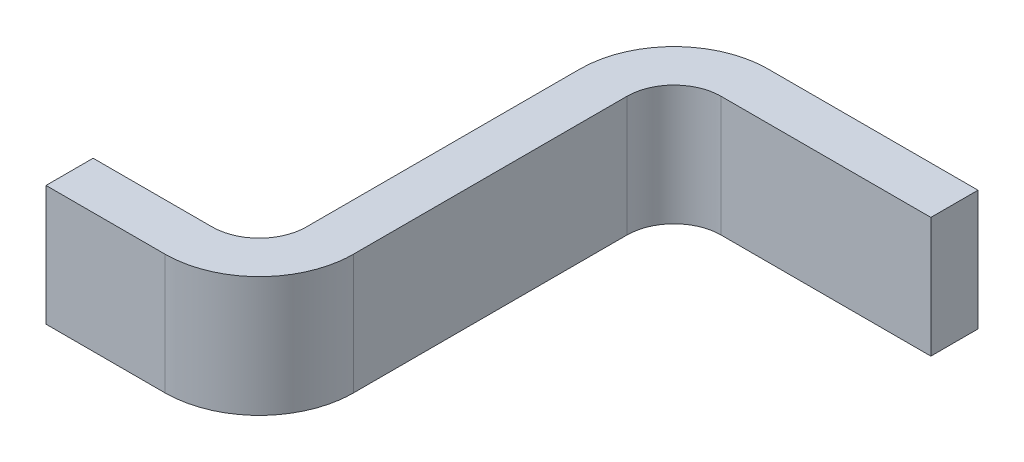
ISO-10303-21;
HEADER;
FILE_DESCRIPTION(('STEP AP214'),'2;1');
FILE_NAME('part.step','',(''),(''),'','','');
FILE_SCHEMA(('AUTOMOTIVE_DESIGN { 1 0 10303 214 1 1 1 1 }'));
ENDSEC;
DATA;
#1=APPLICATION_CONTEXT('core data for automotive mechanical design processes');
#2=APPLICATION_PROTOCOL_DEFINITION('international standard','automotive_design',2000,#1);
#3=PRODUCT_CONTEXT('',#1,'mechanical');
#4=PRODUCT('Part','Part','',(#3));
#5=PRODUCT_RELATED_PRODUCT_CATEGORY('part','',(#4));
#6=PRODUCT_DEFINITION_FORMATION('','',#4);
#7=PRODUCT_DEFINITION_CONTEXT('part definition',#1,'design');
#8=PRODUCT_DEFINITION('design','',#6,#7);
#9=PRODUCT_DEFINITION_SHAPE('','',#8);
#10=(LENGTH_UNIT() NAMED_UNIT(*) SI_UNIT(.MILLI.,.METRE.));
#11=(NAMED_UNIT(*) PLANE_ANGLE_UNIT() SI_UNIT($,.RADIAN.));
#12=(NAMED_UNIT(*) SI_UNIT($,.STERADIAN.) SOLID_ANGLE_UNIT());
#13=UNCERTAINTY_MEASURE_WITH_UNIT(LENGTH_MEASURE(1.E-05),#10,'distance_accuracy_value','');
#14=(GEOMETRIC_REPRESENTATION_CONTEXT(3) GLOBAL_UNCERTAINTY_ASSIGNED_CONTEXT((#13)) GLOBAL_UNIT_ASSIGNED_CONTEXT((#10,
#11,#12)) REPRESENTATION_CONTEXT('',''));
#15=CARTESIAN_POINT('',(0.,0.,0.));
#16=DIRECTION('',(0.,0.,1.));
#17=DIRECTION('',(1.,0.,0.));
#18=AXIS2_PLACEMENT_3D('',#15,#16,#17);
#19=CARTESIAN_POINT('',(5.59720518814807,7.03646464081757,3.04031594000001));
#20=CARTESIAN_POINT('',(5.59720518814807,6.73046464081757,3.04031594000001));
#21=CARTESIAN_POINT('',(5.59720518814807,7.03646464081757,2.92031594000001));
#22=CARTESIAN_POINT('',(5.59720518814807,6.73046464081757,2.92031594000001));
#23=(BOUNDED_SURFACE() B_SPLINE_SURFACE(1,1,((#19,#20),(#21,#22)),.UNSPECIFIED.,.F.,.F.,
.F.) B_SPLINE_SURFACE_WITH_KNOTS((2,2),(2,2),(-0.00011,1.E-05),(-0.0002805,2.55E-05),
.UNSPECIFIED.) GEOMETRIC_REPRESENTATION_ITEM() RATIONAL_B_SPLINE_SURFACE(((1.,1.),(1.,1.))) REPRESENTATION_ITEM('') SURFACE());
#24=CARTESIAN_POINT('',(5.59720518814807,6.75596464081757,2.93031594000001));
#25=CARTESIAN_POINT('',(5.59720518814807,6.75596464081757,3.03031594000001));
#26=(BOUNDED_CURVE() B_SPLINE_CURVE(1,(#24,#25),.UNSPECIFIED.,.F.,
.F.) B_SPLINE_CURVE_WITH_KNOTS((2,2),(-0.0001,0.),
.UNSPECIFIED.) CURVE() GEOMETRIC_REPRESENTATION_ITEM() RATIONAL_B_SPLINE_CURVE((1.,1.)) REPRESENTATION_ITEM(''));
#27=CARTESIAN_POINT('',(5.59720518814807,6.75596464081757,2.93031594000001));
#28=VERTEX_POINT('',#27);
#29=CARTESIAN_POINT('',(5.59720518814807,6.75596464081757,3.03031594000001));
#30=VERTEX_POINT('',#29);
#31=EDGE_CURVE('E371',#28,#30,#26,.T.);
#32=CARTESIAN_POINT('',(5.59720518814807,6.75596464081757,3.03031594000001));
#33=CARTESIAN_POINT('',(5.59720518814807,7.01096464081757,3.03031594000001));
#34=(BOUNDED_CURVE() B_SPLINE_CURVE(1,(#32,#33),.UNSPECIFIED.,.F.,
.F.) B_SPLINE_CURVE_WITH_KNOTS((2,2),(-0.000255,0.),
.UNSPECIFIED.) CURVE() GEOMETRIC_REPRESENTATION_ITEM() RATIONAL_B_SPLINE_CURVE((1.,1.)) REPRESENTATION_ITEM(''));
#35=CARTESIAN_POINT('',(5.59720518814807,7.01096464081757,3.03031594000001));
#36=VERTEX_POINT('',#35);
#37=EDGE_CURVE('E204',#30,#36,#34,.T.);
#38=CARTESIAN_POINT('',(5.59720518814807,7.01096464081757,3.03031594000001));
#39=CARTESIAN_POINT('',(5.59720518814807,7.01096464081757,2.93031594000001));
#40=(BOUNDED_CURVE() B_SPLINE_CURVE(1,(#38,#39),.UNSPECIFIED.,.F.,
.F.) B_SPLINE_CURVE_WITH_KNOTS((2,2),(-0.0001,0.),
.UNSPECIFIED.) CURVE() GEOMETRIC_REPRESENTATION_ITEM() RATIONAL_B_SPLINE_CURVE((1.,1.)) REPRESENTATION_ITEM(''));
#41=CARTESIAN_POINT('',(5.59720518814807,7.01096464081757,2.93031594000001));
#42=VERTEX_POINT('',#41);
#43=EDGE_CURVE('E167',#36,#42,#40,.T.);
#44=CARTESIAN_POINT('',(5.59720518814807,7.01096464081757,2.93031594000001));
#45=CARTESIAN_POINT('',(5.59720518814807,6.75596464081757,2.93031594000001));
#46=(BOUNDED_CURVE() B_SPLINE_CURVE(1,(#44,#45),.UNSPECIFIED.,.F.,
.F.) B_SPLINE_CURVE_WITH_KNOTS((2,2),(-0.000255,0.),
.UNSPECIFIED.) CURVE() GEOMETRIC_REPRESENTATION_ITEM() RATIONAL_B_SPLINE_CURVE((1.,1.)) REPRESENTATION_ITEM(''));
#47=EDGE_CURVE('E11',#42,#28,#46,.T.);
#48=ORIENTED_EDGE('',*,*,#31,.T.);
#49=ORIENTED_EDGE('',*,*,#37,.T.);
#50=ORIENTED_EDGE('',*,*,#43,.T.);
#51=ORIENTED_EDGE('',*,*,#47,.T.);
#52=EDGE_LOOP('',(#48,#49,#50,#51));
#53=FACE_BOUND('',#52,.T.);
#54=ADVANCED_FACE('F17',(#53),#23,.T.);
#55=CARTESIAN_POINT('',(5.57195518814807,6.73046464081757,2.93031594000001));
#56=CARTESIAN_POINT('',(5.87495518814806,6.73046464081757,2.93031594000001));
#57=CARTESIAN_POINT('',(5.57195518814807,7.03646464081757,2.93031594000001));
#58=CARTESIAN_POINT('',(5.87495518814806,7.03646464081757,2.93031594000001));
#59=(BOUNDED_SURFACE() B_SPLINE_SURFACE(1,1,((#55,#56),(#57,#58)),.UNSPECIFIED.,.F.,.F.,
.F.) B_SPLINE_SURFACE_WITH_KNOTS((2,2),(2,2),(-0.0002805,2.55E-05),(-2.5249999999999E-05,
0.000277749999999989),
.UNSPECIFIED.) GEOMETRIC_REPRESENTATION_ITEM() RATIONAL_B_SPLINE_SURFACE(((1.,1.),(1.,1.))) REPRESENTATION_ITEM('') SURFACE());
#60=CARTESIAN_POINT('',(5.84970518814806,7.01096464081757,2.93031594000001));
#61=CARTESIAN_POINT('',(5.84970518814806,6.75596464081757,2.93031594000001));
#62=(BOUNDED_CURVE() B_SPLINE_CURVE(1,(#60,#61),.UNSPECIFIED.,.F.,
.F.) B_SPLINE_CURVE_WITH_KNOTS((2,2),(-0.000255,0.),
.UNSPECIFIED.) CURVE() GEOMETRIC_REPRESENTATION_ITEM() RATIONAL_B_SPLINE_CURVE((1.,1.)) REPRESENTATION_ITEM(''));
#63=CARTESIAN_POINT('',(5.84970518814806,7.01096464081757,2.93031594000001));
#64=VERTEX_POINT('',#63);
#65=CARTESIAN_POINT('',(5.84970518814806,6.75596464081757,2.93031594000001));
#66=VERTEX_POINT('',#65);
#67=EDGE_CURVE('E32',#64,#66,#62,.T.);
#68=CARTESIAN_POINT('',(5.59720518814807,6.75596464081757,2.93031594000001));
#69=CARTESIAN_POINT('',(5.84970518814806,6.75596464081757,2.93031594000001));
#70=(BOUNDED_CURVE() B_SPLINE_CURVE(1,(#68,#69),.UNSPECIFIED.,.F.,
.F.) B_SPLINE_CURVE_WITH_KNOTS((2,2),(0.,0.00025249999999999),
.UNSPECIFIED.) CURVE() GEOMETRIC_REPRESENTATION_ITEM() RATIONAL_B_SPLINE_CURVE((1.,1.)) REPRESENTATION_ITEM(''));
#71=EDGE_CURVE('E203',#28,#66,#70,.T.);
#72=CARTESIAN_POINT('',(5.59720518814807,7.01096464081757,2.93031594000001));
#73=CARTESIAN_POINT('',(5.84970518814806,7.01096464081757,2.93031594000001));
#74=(BOUNDED_CURVE() B_SPLINE_CURVE(1,(#72,#73),.UNSPECIFIED.,.F.,
.F.) B_SPLINE_CURVE_WITH_KNOTS((2,2),(0.,0.00025249999999999),
.UNSPECIFIED.) CURVE() GEOMETRIC_REPRESENTATION_ITEM() RATIONAL_B_SPLINE_CURVE((1.,1.)) REPRESENTATION_ITEM(''));
#75=EDGE_CURVE('E158',#42,#64,#74,.T.);
#76=ORIENTED_EDGE('',*,*,#67,.T.);
#77=ORIENTED_EDGE('',*,*,#71,.F.);
#78=ORIENTED_EDGE('',*,*,#47,.F.);
#79=ORIENTED_EDGE('',*,*,#75,.T.);
#80=EDGE_LOOP('',(#76,#77,#78,#79));
#81=FACE_BOUND('',#80,.T.);
#82=ADVANCED_FACE('F714',(#81),#59,.T.);
#83=CARTESIAN_POINT('',(5.84970518814806,6.75596464081757,2.93031594000001));
#84=CARTESIAN_POINT('',(5.94970518814806,6.75596464081758,2.93031594000001));
#85=CARTESIAN_POINT('',(5.94970518814806,6.75596464081757,2.83031594000001));
#86=CARTESIAN_POINT('',(5.84970518814806,7.01096464081757,2.93031594000001));
#87=CARTESIAN_POINT('',(5.94970518814806,7.01096464081758,2.93031594000001));
#88=CARTESIAN_POINT('',(5.94970518814806,7.01096464081757,2.83031594000001));
#89=(BOUNDED_SURFACE() B_SPLINE_SURFACE(1,2,((#83,#84,#85),(#86,#87,#88)),.UNSPECIFIED.,.F.,.F.,
.F.) B_SPLINE_SURFACE_WITH_KNOTS((2,2),(3,3),(0.,2.55),(-3.14159265358979,-1.5707963267949),
.UNSPECIFIED.) GEOMETRIC_REPRESENTATION_ITEM() RATIONAL_B_SPLINE_SURFACE(((1.,0.707106781186548,
1.),(1.,0.707106781186548,1.))) REPRESENTATION_ITEM('') SURFACE());
#90=CARTESIAN_POINT('',(5.94970518814808,6.75596464081757,2.83031594000001));
#91=CARTESIAN_POINT('',(5.94970518814808,7.01096464081757,2.83031594000001));
#92=(BOUNDED_CURVE() B_SPLINE_CURVE(1,(#90,#91),.UNSPECIFIED.,.F.,
.F.) B_SPLINE_CURVE_WITH_KNOTS((2,2),(0.,0.000255),
.UNSPECIFIED.) CURVE() GEOMETRIC_REPRESENTATION_ITEM() RATIONAL_B_SPLINE_CURVE((1.,1.)) REPRESENTATION_ITEM(''));
#93=CARTESIAN_POINT('',(5.94970518814808,6.75596464081757,2.83031594000001));
#94=VERTEX_POINT('',#93);
#95=CARTESIAN_POINT('',(5.94970518814808,7.01096464081757,2.83031594000001));
#96=VERTEX_POINT('',#95);
#97=EDGE_CURVE('E232',#94,#96,#92,.T.);
#98=CARTESIAN_POINT('',(5.84970518814806,6.75596464081757,2.93031594000001));
#99=CARTESIAN_POINT('',(5.94970518814806,6.75596464081758,2.93031594000001));
#100=CARTESIAN_POINT('',(5.94970518814806,6.75596464081757,2.83031594000001));
#101=(BOUNDED_CURVE() B_SPLINE_CURVE(2,(#98,#99,#100),.UNSPECIFIED.,.F.,
.F.) B_SPLINE_CURVE_WITH_KNOTS((3,3),(0.,1.5707963267949),
.UNSPECIFIED.) CURVE() GEOMETRIC_REPRESENTATION_ITEM() RATIONAL_B_SPLINE_CURVE((1.,
0.707106781186545,1.)) REPRESENTATION_ITEM(''));
#102=EDGE_CURVE('E248',#66,#94,#101,.T.);
#103=CARTESIAN_POINT('',(5.84970518814806,7.01096464081757,2.93031594000001));
#104=CARTESIAN_POINT('',(5.94970518814806,7.01096464081757,2.93031594000001));
#105=CARTESIAN_POINT('',(5.94970518814806,7.01096464081757,2.83031594000001));
#106=(BOUNDED_CURVE() B_SPLINE_CURVE(2,(#103,#104,#105),.UNSPECIFIED.,.F.,
.F.) B_SPLINE_CURVE_WITH_KNOTS((3,3),(-3.14159265358979,-1.5707963267949),
.UNSPECIFIED.) CURVE() GEOMETRIC_REPRESENTATION_ITEM() RATIONAL_B_SPLINE_CURVE((1.,
0.707106781186545,1.)) REPRESENTATION_ITEM(''));
#107=EDGE_CURVE('E168',#64,#96,#106,.T.);
#108=ORIENTED_EDGE('',*,*,#97,.F.);
#109=ORIENTED_EDGE('',*,*,#102,.F.);
#110=ORIENTED_EDGE('',*,*,#67,.F.);
#111=ORIENTED_EDGE('',*,*,#107,.T.);
#112=EDGE_LOOP('',(#108,#109,#110,#111));
#113=FACE_BOUND('',#112,.T.);
#114=ADVANCED_FACE('F718',(#113),#89,.T.);
#115=CARTESIAN_POINT('',(5.94970518814808,6.73046464081757,2.88831594000001));
#116=CARTESIAN_POINT('',(5.94970518814808,6.73046464081757,2.19231594000001));
#117=CARTESIAN_POINT('',(5.94970518814808,7.03646464081757,2.88831594000001));
#118=CARTESIAN_POINT('',(5.94970518814808,7.03646464081757,2.19231594000001));
#119=(BOUNDED_SURFACE() B_SPLINE_SURFACE(1,1,((#115,#116),(#117,#118)),.UNSPECIFIED.,.F.,.F.,
.F.) B_SPLINE_SURFACE_WITH_KNOTS((2,2),(2,2),(-0.0002805,2.55E-05),(-5.8E-05,0.000638),
.UNSPECIFIED.) GEOMETRIC_REPRESENTATION_ITEM() RATIONAL_B_SPLINE_SURFACE(((1.,1.),(1.,1.))) REPRESENTATION_ITEM('') SURFACE());
#120=CARTESIAN_POINT('',(5.94970518814808,7.01096464081757,2.25031594000001));
#121=CARTESIAN_POINT('',(5.94970518814808,6.75596464081757,2.25031594000001));
#122=(BOUNDED_CURVE() B_SPLINE_CURVE(1,(#120,#121),.UNSPECIFIED.,.F.,
.F.) B_SPLINE_CURVE_WITH_KNOTS((2,2),(-0.000255,0.),
.UNSPECIFIED.) CURVE() GEOMETRIC_REPRESENTATION_ITEM() RATIONAL_B_SPLINE_CURVE((1.,1.)) REPRESENTATION_ITEM(''));
#123=CARTESIAN_POINT('',(5.94970518814808,7.01096464081757,2.25031594000001));
#124=VERTEX_POINT('',#123);
#125=CARTESIAN_POINT('',(5.94970518814808,6.75596464081757,2.25031594000001));
#126=VERTEX_POINT('',#125);
#127=EDGE_CURVE('E224',#124,#126,#122,.T.);
#128=CARTESIAN_POINT('',(5.94970518814808,6.75596464081757,2.83031594000001));
#129=CARTESIAN_POINT('',(5.94970518814808,6.75596464081757,2.25031594000001));
#130=(BOUNDED_CURVE() B_SPLINE_CURVE(1,(#128,#129),.UNSPECIFIED.,.F.,
.F.) B_SPLINE_CURVE_WITH_KNOTS((2,2),(0.0002,0.00078),
.UNSPECIFIED.) CURVE() GEOMETRIC_REPRESENTATION_ITEM() RATIONAL_B_SPLINE_CURVE((1.,1.)) REPRESENTATION_ITEM(''));
#131=EDGE_CURVE('E271',#94,#126,#130,.T.);
#132=CARTESIAN_POINT('',(5.94970518814808,7.01096464081757,2.83031594000001));
#133=CARTESIAN_POINT('',(5.94970518814808,7.01096464081757,2.25031594000001));
#134=(BOUNDED_CURVE() B_SPLINE_CURVE(1,(#132,#133),.UNSPECIFIED.,.F.,
.F.) B_SPLINE_CURVE_WITH_KNOTS((2,2),(0.,0.00058),
.UNSPECIFIED.) CURVE() GEOMETRIC_REPRESENTATION_ITEM() RATIONAL_B_SPLINE_CURVE((1.,1.)) REPRESENTATION_ITEM(''));
#135=EDGE_CURVE('E186',#96,#124,#134,.T.);
#136=ORIENTED_EDGE('',*,*,#127,.T.);
#137=ORIENTED_EDGE('',*,*,#131,.F.);
#138=ORIENTED_EDGE('',*,*,#97,.T.);
#139=ORIENTED_EDGE('',*,*,#135,.T.);
#140=EDGE_LOOP('',(#136,#137,#138,#139));
#141=FACE_BOUND('',#140,.T.);
#142=ADVANCED_FACE('F19',(#141),#119,.T.);
#143=CARTESIAN_POINT('',(5.94970518814809,6.75596464081757,2.25031594000001));
#144=CARTESIAN_POINT('',(5.94970518814809,6.75596464081758,2.05031594000001));
#145=CARTESIAN_POINT('',(6.14970518814809,6.75596464081757,2.05031594000001));
#146=CARTESIAN_POINT('',(5.94970518814809,7.01096464081757,2.25031594000001));
#147=CARTESIAN_POINT('',(5.94970518814809,7.01096464081758,2.05031594000001));
#148=CARTESIAN_POINT('',(6.14970518814809,7.01096464081757,2.05031594000001));
#149=(BOUNDED_SURFACE() B_SPLINE_SURFACE(1,2,((#143,#144,#145),(#146,#147,#148)),.UNSPECIFIED.,
.F.,.F.,.F.) B_SPLINE_SURFACE_WITH_KNOTS((2,2),(3,3),(-1.275,0.),(-1.5707963267949,0.),
.UNSPECIFIED.) GEOMETRIC_REPRESENTATION_ITEM() RATIONAL_B_SPLINE_SURFACE(((1.,0.707106781186548,
1.),(1.,0.707106781186548,1.))) REPRESENTATION_ITEM('') SURFACE());
#150=CARTESIAN_POINT('',(5.94970518814809,7.01096464081757,2.25031594000001));
#151=CARTESIAN_POINT('',(5.94970518814809,7.01096464081757,2.05031594000001));
#152=CARTESIAN_POINT('',(6.14970518814809,7.01096464081757,2.05031594000001));
#153=(BOUNDED_CURVE() B_SPLINE_CURVE(2,(#150,#151,#152),.UNSPECIFIED.,.F.,
.F.) B_SPLINE_CURVE_WITH_KNOTS((3,3),(-1.5707963267949,0.),
.UNSPECIFIED.) CURVE() GEOMETRIC_REPRESENTATION_ITEM() RATIONAL_B_SPLINE_CURVE((1.,
0.70710678118654,1.)) REPRESENTATION_ITEM(''));
#154=CARTESIAN_POINT('',(6.14970518814809,7.01096464081757,2.05031594000001));
#155=VERTEX_POINT('',#154);
#156=EDGE_CURVE('E195',#124,#155,#153,.T.);
#157=CARTESIAN_POINT('',(6.14970518814809,7.01096464081757,2.05031594000001));
#158=CARTESIAN_POINT('',(6.14970518814809,6.75596464081757,2.05031594000001));
#159=(BOUNDED_CURVE() B_SPLINE_CURVE(1,(#157,#158),.UNSPECIFIED.,.F.,
.F.) B_SPLINE_CURVE_WITH_KNOTS((2,2),(-0.000255,0.),
.UNSPECIFIED.) CURVE() GEOMETRIC_REPRESENTATION_ITEM() RATIONAL_B_SPLINE_CURVE((1.,1.)) REPRESENTATION_ITEM(''));
#160=CARTESIAN_POINT('',(6.14970518814809,6.75596464081757,2.05031594000001));
#161=VERTEX_POINT('',#160);
#162=EDGE_CURVE('E41',#155,#161,#159,.T.);
#163=CARTESIAN_POINT('',(5.94970518814809,6.75596464081757,2.25031594000001));
#164=CARTESIAN_POINT('',(5.94970518814809,6.75596464081757,2.05031594000001));
#165=CARTESIAN_POINT('',(6.14970518814809,6.75596464081757,2.05031594000001));
#166=(BOUNDED_CURVE() B_SPLINE_CURVE(2,(#163,#164,#165),.UNSPECIFIED.,.F.,
.F.) B_SPLINE_CURVE_WITH_KNOTS((3,3),(1.5707963267949,3.14159265358979),
.UNSPECIFIED.) CURVE() GEOMETRIC_REPRESENTATION_ITEM() RATIONAL_B_SPLINE_CURVE((1.,
0.70710678118654,1.)) REPRESENTATION_ITEM(''));
#167=EDGE_CURVE('E296',#126,#161,#166,.T.);
#168=ORIENTED_EDGE('',*,*,#156,.T.);
#169=ORIENTED_EDGE('',*,*,#162,.T.);
#170=ORIENTED_EDGE('',*,*,#167,.F.);
#171=ORIENTED_EDGE('',*,*,#127,.F.);
#172=EDGE_LOOP('',(#168,#169,#170,#171));
#173=FACE_BOUND('',#172,.T.);
#174=ADVANCED_FACE('F726',(#173),#149,.T.);
#175=CARTESIAN_POINT('',(6.10520518814809,6.73046464081757,2.05031594000001));
#176=CARTESIAN_POINT('',(6.63920518814809,6.73046464081757,2.05031594000001));
#177=CARTESIAN_POINT('',(6.10520518814809,7.03646464081757,2.05031594000001));
#178=CARTESIAN_POINT('',(6.63920518814809,7.03646464081757,2.05031594000001));
#179=(BOUNDED_SURFACE() B_SPLINE_SURFACE(1,1,((#175,#176),(#177,#178)),.UNSPECIFIED.,.F.,.F.,
.F.) B_SPLINE_SURFACE_WITH_KNOTS((2,2),(2,2),(-0.0002805,2.55E-05),(-4.45E-05,0.0004895),
.UNSPECIFIED.) GEOMETRIC_REPRESENTATION_ITEM() RATIONAL_B_SPLINE_SURFACE(((1.,1.),(1.,1.))) REPRESENTATION_ITEM('') SURFACE());
#180=CARTESIAN_POINT('',(6.59470518814809,7.01096464081757,2.05031594000001));
#181=CARTESIAN_POINT('',(6.59470518814809,6.75596464081757,2.05031594000001));
#182=(BOUNDED_CURVE() B_SPLINE_CURVE(1,(#180,#181),.UNSPECIFIED.,.F.,
.F.) B_SPLINE_CURVE_WITH_KNOTS((2,2),(-0.000255,0.),
.UNSPECIFIED.) CURVE() GEOMETRIC_REPRESENTATION_ITEM() RATIONAL_B_SPLINE_CURVE((1.,1.)) REPRESENTATION_ITEM(''));
#183=CARTESIAN_POINT('',(6.59470518814809,7.01096464081757,2.05031594000001));
#184=VERTEX_POINT('',#183);
#185=CARTESIAN_POINT('',(6.59470518814809,6.75596464081757,2.05031594000001));
#186=VERTEX_POINT('',#185);
#187=EDGE_CURVE('E305',#184,#186,#182,.T.);
#188=CARTESIAN_POINT('',(6.14970518814809,6.75596464081757,2.05031594000001));
#189=CARTESIAN_POINT('',(6.59470518814809,6.75596464081757,2.05031594000001));
#190=(BOUNDED_CURVE() B_SPLINE_CURVE(1,(#188,#189),.UNSPECIFIED.,.F.,
.F.) B_SPLINE_CURVE_WITH_KNOTS((2,2),(0.00055250000000002,0.00099750000000002),
.UNSPECIFIED.) CURVE() GEOMETRIC_REPRESENTATION_ITEM() RATIONAL_B_SPLINE_CURVE((1.,1.)) REPRESENTATION_ITEM(''));
#191=EDGE_CURVE('E23',#161,#186,#190,.T.);
#192=CARTESIAN_POINT('',(6.14970518814809,7.01096464081757,2.05031594000001));
#193=CARTESIAN_POINT('',(6.59470518814809,7.01096464081757,2.05031594000001));
#194=(BOUNDED_CURVE() B_SPLINE_CURVE(1,(#192,#193),.UNSPECIFIED.,.F.,
.F.) B_SPLINE_CURVE_WITH_KNOTS((2,2),(0.,0.000445),
.UNSPECIFIED.) CURVE() GEOMETRIC_REPRESENTATION_ITEM() RATIONAL_B_SPLINE_CURVE((1.,1.)) REPRESENTATION_ITEM(''));
#195=EDGE_CURVE('E240',#155,#184,#194,.T.);
#196=ORIENTED_EDGE('',*,*,#187,.T.);
#197=ORIENTED_EDGE('',*,*,#191,.F.);
#198=ORIENTED_EDGE('',*,*,#162,.F.);
#199=ORIENTED_EDGE('',*,*,#195,.T.);
#200=EDGE_LOOP('',(#196,#197,#198,#199));
#201=FACE_BOUND('',#200,.T.);
#202=ADVANCED_FACE('F413',(#201),#179,.T.);
#203=CARTESIAN_POINT('',(5.49745518814807,6.75596464081757,3.12831594000001));
#204=CARTESIAN_POINT('',(6.69445518814809,6.75596464081757,3.12831594000001));
#205=CARTESIAN_POINT('',(5.49745518814807,6.75596464081757,1.95231594000001));
#206=CARTESIAN_POINT('',(6.69445518814809,6.75596464081757,1.95231594000001));
#207=(BOUNDED_SURFACE() B_SPLINE_SURFACE(1,1,((#203,#204),(#205,#206)),.UNSPECIFIED.,.F.,.F.,
.F.) B_SPLINE_SURFACE_WITH_KNOTS((2,2),(2,2),(-0.001078,9.8E-05),(-9.9750000000002E-05,
0.00109725000000002),
.UNSPECIFIED.) GEOMETRIC_REPRESENTATION_ITEM() RATIONAL_B_SPLINE_SURFACE(((1.,1.),(1.,1.))) REPRESENTATION_ITEM('') SURFACE());
#208=CARTESIAN_POINT('',(6.59470518814809,6.75596464081757,2.05031594000001));
#209=CARTESIAN_POINT('',(6.59470518814809,6.75596464081757,2.15031594000001));
#210=(BOUNDED_CURVE() B_SPLINE_CURVE(1,(#208,#209),.UNSPECIFIED.,.F.,
.F.) B_SPLINE_CURVE_WITH_KNOTS((2,2),(-0.00098,-0.00088),
.UNSPECIFIED.) CURVE() GEOMETRIC_REPRESENTATION_ITEM() RATIONAL_B_SPLINE_CURVE((1.,1.)) REPRESENTATION_ITEM(''));
#211=CARTESIAN_POINT('',(6.59470518814809,6.75596464081757,2.15031594000001));
#212=VERTEX_POINT('',#211);
#213=EDGE_CURVE('E363',#186,#212,#210,.T.);
#214=CARTESIAN_POINT('',(6.14970518814809,6.75596464081757,2.15031594000001));
#215=CARTESIAN_POINT('',(6.59470518814809,6.75596464081757,2.15031594000001));
#216=(BOUNDED_CURVE() B_SPLINE_CURVE(1,(#214,#215),.UNSPECIFIED.,.F.,
.F.) B_SPLINE_CURVE_WITH_KNOTS((2,2),(0.,0.000445),
.UNSPECIFIED.) CURVE() GEOMETRIC_REPRESENTATION_ITEM() RATIONAL_B_SPLINE_CURVE((1.,1.)) REPRESENTATION_ITEM(''));
#217=CARTESIAN_POINT('',(6.14970518814809,6.75596464081757,2.15031594000001));
#218=VERTEX_POINT('',#217);
#219=EDGE_CURVE('E169',#218,#212,#216,.T.);
#220=CARTESIAN_POINT('',(6.04970518814809,6.75596464081757,2.25031594000001));
#221=CARTESIAN_POINT('',(6.04970518814809,6.75596464081757,2.15031594000001));
#222=CARTESIAN_POINT('',(6.14970518814809,6.75596464081757,2.15031594000001));
#223=(BOUNDED_CURVE() B_SPLINE_CURVE(2,(#220,#221,#222),.UNSPECIFIED.,.F.,
.F.) B_SPLINE_CURVE_WITH_KNOTS((3,3),(1.5707963267949,3.14159265358979),
.UNSPECIFIED.) CURVE() GEOMETRIC_REPRESENTATION_ITEM() RATIONAL_B_SPLINE_CURVE((1.,
0.707106781186553,1.)) REPRESENTATION_ITEM(''));
#224=CARTESIAN_POINT('',(6.04970518814807,6.75596464081757,2.25031594000001));
#225=VERTEX_POINT('',#224);
#226=EDGE_CURVE('E123',#225,#218,#223,.T.);
#227=CARTESIAN_POINT('',(6.04970518814807,6.75596464081757,2.83031594000001));
#228=CARTESIAN_POINT('',(6.04970518814807,6.75596464081757,2.25031594000001));
#229=(BOUNDED_CURVE() B_SPLINE_CURVE(1,(#227,#228),.UNSPECIFIED.,.F.,
.F.) B_SPLINE_CURVE_WITH_KNOTS((2,2),(0.,0.00058),
.UNSPECIFIED.) CURVE() GEOMETRIC_REPRESENTATION_ITEM() RATIONAL_B_SPLINE_CURVE((1.,1.)) REPRESENTATION_ITEM(''));
#230=CARTESIAN_POINT('',(6.04970518814807,6.75596464081757,2.83031594000001));
#231=VERTEX_POINT('',#230);
#232=EDGE_CURVE('E116',#231,#225,#229,.T.);
#233=CARTESIAN_POINT('',(5.84970518814806,6.75596464081757,3.03031594000001));
#234=CARTESIAN_POINT('',(6.04970518814806,6.75596464081757,3.03031594000001));
#235=CARTESIAN_POINT('',(6.04970518814806,6.75596464081757,2.83031594000001));
#236=(BOUNDED_CURVE() B_SPLINE_CURVE(2,(#233,#234,#235),.UNSPECIFIED.,.F.,
.F.) B_SPLINE_CURVE_WITH_KNOTS((3,3),(0.,1.5707963267949),
.UNSPECIFIED.) CURVE() GEOMETRIC_REPRESENTATION_ITEM() RATIONAL_B_SPLINE_CURVE((1.,
0.707106781186537,1.)) REPRESENTATION_ITEM(''));
#237=CARTESIAN_POINT('',(5.84970518814806,6.75596464081757,3.03031594000001));
#238=VERTEX_POINT('',#237);
#239=EDGE_CURVE('E105',#238,#231,#236,.T.);
#240=CARTESIAN_POINT('',(5.59720518814807,6.75596464081757,3.03031594000001));
#241=CARTESIAN_POINT('',(5.84970518814806,6.75596464081757,3.03031594000001));
#242=(BOUNDED_CURVE() B_SPLINE_CURVE(1,(#240,#241),.UNSPECIFIED.,.F.,
.F.) B_SPLINE_CURVE_WITH_KNOTS((2,2),(0.,0.00025249999999999),
.UNSPECIFIED.) CURVE() GEOMETRIC_REPRESENTATION_ITEM() RATIONAL_B_SPLINE_CURVE((1.,1.)) REPRESENTATION_ITEM(''));
#243=EDGE_CURVE('E196',#30,#238,#242,.T.);
#244=ORIENTED_EDGE('',*,*,#71,.T.);
#245=ORIENTED_EDGE('',*,*,#102,.T.);
#246=ORIENTED_EDGE('',*,*,#131,.T.);
#247=ORIENTED_EDGE('',*,*,#167,.T.);
#248=ORIENTED_EDGE('',*,*,#191,.T.);
#249=ORIENTED_EDGE('',*,*,#213,.T.);
#250=ORIENTED_EDGE('',*,*,#219,.F.);
#251=ORIENTED_EDGE('',*,*,#226,.F.);
#252=ORIENTED_EDGE('',*,*,#232,.F.);
#253=ORIENTED_EDGE('',*,*,#239,.F.);
#254=ORIENTED_EDGE('',*,*,#243,.F.);
#255=ORIENTED_EDGE('',*,*,#31,.F.);
#256=EDGE_LOOP('',(#244,#245,#246,#247,#248,#249,#250,#251,#252,#253,#254,#255));
#257=FACE_BOUND('',#256,.T.);
#258=ADVANCED_FACE('F120',(#257),#207,.T.);
#259=CARTESIAN_POINT('',(5.57195518814807,7.03646464081757,3.03031594000001));
#260=CARTESIAN_POINT('',(5.87495518814806,7.03646464081757,3.03031594000001));
#261=CARTESIAN_POINT('',(5.57195518814807,6.73046464081757,3.03031594000001));
#262=CARTESIAN_POINT('',(5.87495518814806,6.73046464081757,3.03031594000001));
#263=(BOUNDED_SURFACE() B_SPLINE_SURFACE(1,1,((#259,#260),(#261,#262)),.UNSPECIFIED.,.F.,.F.,
.F.) B_SPLINE_SURFACE_WITH_KNOTS((2,2),(2,2),(-0.0002805,2.55E-05),(-2.5249999999999E-05,
0.000277749999999989),
.UNSPECIFIED.) GEOMETRIC_REPRESENTATION_ITEM() RATIONAL_B_SPLINE_SURFACE(((1.,1.),(1.,1.))) REPRESENTATION_ITEM('') SURFACE());
#264=CARTESIAN_POINT('',(5.84970518814806,6.75596464081757,3.03031594000001));
#265=CARTESIAN_POINT('',(5.84970518814806,7.01096464081757,3.03031594000001));
#266=(BOUNDED_CURVE() B_SPLINE_CURVE(1,(#264,#265),.UNSPECIFIED.,.F.,
.F.) B_SPLINE_CURVE_WITH_KNOTS((2,2),(-0.000255,0.),
.UNSPECIFIED.) CURVE() GEOMETRIC_REPRESENTATION_ITEM() RATIONAL_B_SPLINE_CURVE((1.,1.)) REPRESENTATION_ITEM(''));
#267=CARTESIAN_POINT('',(5.84970518814806,7.01096464081757,3.03031594000001));
#268=VERTEX_POINT('',#267);
#269=EDGE_CURVE('E112',#238,#268,#266,.T.);
#270=CARTESIAN_POINT('',(5.59720518814807,7.01096464081757,3.03031594000001));
#271=CARTESIAN_POINT('',(5.84970518814806,7.01096464081757,3.03031594000001));
#272=(BOUNDED_CURVE() B_SPLINE_CURVE(1,(#270,#271),.UNSPECIFIED.,.F.,
.F.) B_SPLINE_CURVE_WITH_KNOTS((2,2),(0.,0.00025249999999999),
.UNSPECIFIED.) CURVE() GEOMETRIC_REPRESENTATION_ITEM() RATIONAL_B_SPLINE_CURVE((1.,1.)) REPRESENTATION_ITEM(''));
#273=EDGE_CURVE('E379',#36,#268,#272,.T.);
#274=ORIENTED_EDGE('',*,*,#269,.T.);
#275=ORIENTED_EDGE('',*,*,#273,.F.);
#276=ORIENTED_EDGE('',*,*,#37,.F.);
#277=ORIENTED_EDGE('',*,*,#243,.T.);
#278=EDGE_LOOP('',(#274,#275,#276,#277));
#279=FACE_BOUND('',#278,.T.);
#280=ADVANCED_FACE('F689',(#279),#263,.T.);
#281=CARTESIAN_POINT('',(5.84970518814806,7.01096464081757,3.03031594000001));
#282=CARTESIAN_POINT('',(6.04970518814806,7.01096464081758,3.03031594000001));
#283=CARTESIAN_POINT('',(6.04970518814806,7.01096464081757,2.83031594000001));
#284=CARTESIAN_POINT('',(5.84970518814806,6.75596464081757,3.03031594000001));
#285=CARTESIAN_POINT('',(6.04970518814806,6.75596464081758,3.03031594000001));
#286=CARTESIAN_POINT('',(6.04970518814806,6.75596464081757,2.83031594000001));
#287=(BOUNDED_SURFACE() B_SPLINE_SURFACE(1,2,((#281,#282,#283),(#284,#285,#286)),.UNSPECIFIED.,
.F.,.F.,.F.) B_SPLINE_SURFACE_WITH_KNOTS((2,2),(3,3),(-1.275,0.),(-3.14159265358979,
-1.5707963267949),.UNSPECIFIED.) GEOMETRIC_REPRESENTATION_ITEM() RATIONAL_B_SPLINE_SURFACE(((1.,
0.707106781186548,1.),(1.,0.707106781186548,1.))) REPRESENTATION_ITEM('') SURFACE());
#288=CARTESIAN_POINT('',(6.04970518814807,6.75596464081757,2.83031594000001));
#289=CARTESIAN_POINT('',(6.04970518814807,7.01096464081757,2.83031594000001));
#290=(BOUNDED_CURVE() B_SPLINE_CURVE(1,(#288,#289),.UNSPECIFIED.,.F.,
.F.) B_SPLINE_CURVE_WITH_KNOTS((2,2),(-0.000255,0.),
.UNSPECIFIED.) CURVE() GEOMETRIC_REPRESENTATION_ITEM() RATIONAL_B_SPLINE_CURVE((1.,1.)) REPRESENTATION_ITEM(''));
#291=CARTESIAN_POINT('',(6.04970518814807,7.01096464081757,2.83031594000001));
#292=VERTEX_POINT('',#291);
#293=EDGE_CURVE('E110',#231,#292,#290,.T.);
#294=CARTESIAN_POINT('',(5.84970518814806,7.01096464081757,3.03031594000001));
#295=CARTESIAN_POINT('',(6.04970518814806,7.01096464081757,3.03031594000001));
#296=CARTESIAN_POINT('',(6.04970518814806,7.01096464081757,2.83031594000001));
#297=(BOUNDED_CURVE() B_SPLINE_CURVE(2,(#294,#295,#296),.UNSPECIFIED.,.F.,
.F.) B_SPLINE_CURVE_WITH_KNOTS((3,3),(-3.14159265358979,-1.5707963267949),
.UNSPECIFIED.) CURVE() GEOMETRIC_REPRESENTATION_ITEM() RATIONAL_B_SPLINE_CURVE((1.,
0.707106781186537,1.)) REPRESENTATION_ITEM(''));
#298=EDGE_CURVE('E144',#268,#292,#297,.T.);
#299=ORIENTED_EDGE('',*,*,#239,.T.);
#300=ORIENTED_EDGE('',*,*,#293,.T.);
#301=ORIENTED_EDGE('',*,*,#298,.F.);
#302=ORIENTED_EDGE('',*,*,#269,.F.);
#303=EDGE_LOOP('',(#299,#300,#301,#302));
#304=FACE_BOUND('',#303,.T.);
#305=ADVANCED_FACE('F107',(#304),#287,.T.);
#306=CARTESIAN_POINT('',(6.04970518814807,7.03646464081757,2.88831594000001));
#307=CARTESIAN_POINT('',(6.04970518814807,7.03646464081757,2.19231594000001));
#308=CARTESIAN_POINT('',(6.04970518814807,6.73046464081757,2.88831594000001));
#309=CARTESIAN_POINT('',(6.04970518814807,6.73046464081757,2.19231594000001));
#310=(BOUNDED_SURFACE() B_SPLINE_SURFACE(1,1,((#306,#307),(#308,#309)),.UNSPECIFIED.,.F.,.F.,
.F.) B_SPLINE_SURFACE_WITH_KNOTS((2,2),(2,2),(-0.0002805,2.55E-05),(-5.8E-05,0.000638),
.UNSPECIFIED.) GEOMETRIC_REPRESENTATION_ITEM() RATIONAL_B_SPLINE_SURFACE(((1.,1.),(1.,1.))) REPRESENTATION_ITEM('') SURFACE());
#311=CARTESIAN_POINT('',(6.04970518814807,6.75596464081757,2.25031594000001));
#312=CARTESIAN_POINT('',(6.04970518814807,7.01096464081757,2.25031594000001));
#313=(BOUNDED_CURVE() B_SPLINE_CURVE(1,(#311,#312),.UNSPECIFIED.,.F.,
.F.) B_SPLINE_CURVE_WITH_KNOTS((2,2),(-0.000255,0.),
.UNSPECIFIED.) CURVE() GEOMETRIC_REPRESENTATION_ITEM() RATIONAL_B_SPLINE_CURVE((1.,1.)) REPRESENTATION_ITEM(''));
#314=CARTESIAN_POINT('',(6.04970518814807,7.01096464081757,2.25031594000001));
#315=VERTEX_POINT('',#314);
#316=EDGE_CURVE('E138',#225,#315,#313,.T.);
#317=CARTESIAN_POINT('',(6.04970518814807,7.01096464081757,2.83031594000001));
#318=CARTESIAN_POINT('',(6.04970518814807,7.01096464081757,2.25031594000001));
#319=(BOUNDED_CURVE() B_SPLINE_CURVE(1,(#317,#318),.UNSPECIFIED.,.F.,
.F.) B_SPLINE_CURVE_WITH_KNOTS((2,2),(0.0001,0.00068),
.UNSPECIFIED.) CURVE() GEOMETRIC_REPRESENTATION_ITEM() RATIONAL_B_SPLINE_CURVE((1.,1.)) REPRESENTATION_ITEM(''));
#320=EDGE_CURVE('E130',#292,#315,#319,.T.);
#321=ORIENTED_EDGE('',*,*,#316,.T.);
#322=ORIENTED_EDGE('',*,*,#320,.F.);
#323=ORIENTED_EDGE('',*,*,#293,.F.);
#324=ORIENTED_EDGE('',*,*,#232,.T.);
#325=EDGE_LOOP('',(#321,#322,#323,#324));
#326=FACE_BOUND('',#325,.T.);
#327=ADVANCED_FACE('F128',(#326),#310,.T.);
#328=CARTESIAN_POINT('',(6.04970518814809,7.01096464081757,2.25031594000001));
#329=CARTESIAN_POINT('',(6.04970518814809,7.01096464081758,2.15031594000001));
#330=CARTESIAN_POINT('',(6.14970518814809,7.01096464081757,2.15031594000001));
#331=CARTESIAN_POINT('',(6.04970518814809,6.75596464081757,2.25031594000001));
#332=CARTESIAN_POINT('',(6.04970518814809,6.75596464081758,2.15031594000001));
#333=CARTESIAN_POINT('',(6.14970518814809,6.75596464081757,2.15031594000001));
#334=(BOUNDED_SURFACE() B_SPLINE_SURFACE(1,2,((#328,#329,#330),(#331,#332,#333)),.UNSPECIFIED.,
.F.,.F.,.F.) B_SPLINE_SURFACE_WITH_KNOTS((2,2),(3,3),(0.,2.55),(-1.5707963267949,0.),
.UNSPECIFIED.) GEOMETRIC_REPRESENTATION_ITEM() RATIONAL_B_SPLINE_SURFACE(((1.,0.707106781186548,
1.),(1.,0.707106781186548,1.))) REPRESENTATION_ITEM('') SURFACE());
#335=CARTESIAN_POINT('',(6.14970518814809,7.01096464081757,2.15031594000001));
#336=CARTESIAN_POINT('',(6.14970518814809,6.75596464081757,2.15031594000001));
#337=(BOUNDED_CURVE() B_SPLINE_CURVE(1,(#335,#336),.UNSPECIFIED.,.F.,
.F.) B_SPLINE_CURVE_WITH_KNOTS((2,2),(0.,0.000255),
.UNSPECIFIED.) CURVE() GEOMETRIC_REPRESENTATION_ITEM() RATIONAL_B_SPLINE_CURVE((1.,1.)) REPRESENTATION_ITEM(''));
#338=CARTESIAN_POINT('',(6.14970518814809,7.01096464081757,2.15031594000001));
#339=VERTEX_POINT('',#338);
#340=EDGE_CURVE('E177',#339,#218,#337,.T.);
#341=CARTESIAN_POINT('',(6.04970518814809,7.01096464081757,2.25031594000001));
#342=CARTESIAN_POINT('',(6.04970518814809,7.01096464081757,2.15031594000001));
#343=CARTESIAN_POINT('',(6.14970518814809,7.01096464081757,2.15031594000001));
#344=(BOUNDED_CURVE() B_SPLINE_CURVE(2,(#341,#342,#343),.UNSPECIFIED.,.F.,
.F.) B_SPLINE_CURVE_WITH_KNOTS((3,3),(-1.5707963267949,0.),
.UNSPECIFIED.) CURVE() GEOMETRIC_REPRESENTATION_ITEM() RATIONAL_B_SPLINE_CURVE((1.,
0.707106781186553,1.)) REPRESENTATION_ITEM(''));
#345=EDGE_CURVE('E148',#315,#339,#344,.T.);
#346=ORIENTED_EDGE('',*,*,#340,.F.);
#347=ORIENTED_EDGE('',*,*,#345,.F.);
#348=ORIENTED_EDGE('',*,*,#316,.F.);
#349=ORIENTED_EDGE('',*,*,#226,.T.);
#350=EDGE_LOOP('',(#346,#347,#348,#349));
#351=FACE_BOUND('',#350,.T.);
#352=ADVANCED_FACE('F424',(#351),#334,.T.);
#353=CARTESIAN_POINT('',(6.10520518814809,7.03646464081757,2.15031594000001));
#354=CARTESIAN_POINT('',(6.63920518814809,7.03646464081757,2.15031594000001));
#355=CARTESIAN_POINT('',(6.10520518814809,6.73046464081757,2.15031594000001));
#356=CARTESIAN_POINT('',(6.63920518814809,6.73046464081757,2.15031594000001));
#357=(BOUNDED_SURFACE() B_SPLINE_SURFACE(1,1,((#353,#354),(#355,#356)),.UNSPECIFIED.,.F.,.F.,
.F.) B_SPLINE_SURFACE_WITH_KNOTS((2,2),(2,2),(-0.0002805,2.55E-05),(-4.45E-05,0.0004895),
.UNSPECIFIED.) GEOMETRIC_REPRESENTATION_ITEM() RATIONAL_B_SPLINE_SURFACE(((1.,1.),(1.,1.))) REPRESENTATION_ITEM('') SURFACE());
#358=CARTESIAN_POINT('',(6.59470518814809,6.75596464081757,2.15031594000001));
#359=CARTESIAN_POINT('',(6.59470518814809,7.01096464081757,2.15031594000001));
#360=(BOUNDED_CURVE() B_SPLINE_CURVE(1,(#358,#359),.UNSPECIFIED.,.F.,
.F.) B_SPLINE_CURVE_WITH_KNOTS((2,2),(-0.000255,0.),
.UNSPECIFIED.) CURVE() GEOMETRIC_REPRESENTATION_ITEM() RATIONAL_B_SPLINE_CURVE((1.,1.)) REPRESENTATION_ITEM(''));
#361=CARTESIAN_POINT('',(6.59470518814809,7.01096464081757,2.15031594000001));
#362=VERTEX_POINT('',#361);
#363=EDGE_CURVE('E347',#212,#362,#360,.T.);
#364=CARTESIAN_POINT('',(6.14970518814809,7.01096464081757,2.15031594000001));
#365=CARTESIAN_POINT('',(6.59470518814809,7.01096464081757,2.15031594000001));
#366=(BOUNDED_CURVE() B_SPLINE_CURVE(1,(#364,#365),.UNSPECIFIED.,.F.,
.F.) B_SPLINE_CURVE_WITH_KNOTS((2,2),(0.00055250000000002,0.00099750000000002),
.UNSPECIFIED.) CURVE() GEOMETRIC_REPRESENTATION_ITEM() RATIONAL_B_SPLINE_CURVE((1.,1.)) REPRESENTATION_ITEM(''));
#367=EDGE_CURVE('E157',#339,#362,#366,.T.);
#368=ORIENTED_EDGE('',*,*,#363,.T.);
#369=ORIENTED_EDGE('',*,*,#367,.F.);
#370=ORIENTED_EDGE('',*,*,#340,.T.);
#371=ORIENTED_EDGE('',*,*,#219,.T.);
#372=EDGE_LOOP('',(#368,#369,#370,#371));
#373=FACE_BOUND('',#372,.T.);
#374=ADVANCED_FACE('F421',(#373),#357,.T.);
#375=CARTESIAN_POINT('',(5.49745518814807,7.01096464081757,1.95231594000001));
#376=CARTESIAN_POINT('',(6.69445518814809,7.01096464081757,1.95231594000001));
#377=CARTESIAN_POINT('',(5.49745518814807,7.01096464081757,3.12831594000001));
#378=CARTESIAN_POINT('',(6.69445518814809,7.01096464081757,3.12831594000001));
#379=(BOUNDED_SURFACE() B_SPLINE_SURFACE(1,1,((#375,#376),(#377,#378)),.UNSPECIFIED.,.F.,.F.,
.F.) B_SPLINE_SURFACE_WITH_KNOTS((2,2),(2,2),(-0.000198,0.000978),(-9.9750000000002E-05,
0.00109725000000002),
.UNSPECIFIED.) GEOMETRIC_REPRESENTATION_ITEM() RATIONAL_B_SPLINE_SURFACE(((1.,1.),(1.,1.))) REPRESENTATION_ITEM('') SURFACE());
#380=CARTESIAN_POINT('',(6.59470518814809,7.01096464081757,2.15031594000001));
#381=CARTESIAN_POINT('',(6.59470518814809,7.01096464081757,2.05031594000001));
#382=(BOUNDED_CURVE() B_SPLINE_CURVE(1,(#380,#381),.UNSPECIFIED.,.F.,
.F.) B_SPLINE_CURVE_WITH_KNOTS((2,2),(0.00078,0.00088),
.UNSPECIFIED.) CURVE() GEOMETRIC_REPRESENTATION_ITEM() RATIONAL_B_SPLINE_CURVE((1.,1.)) REPRESENTATION_ITEM(''));
#383=EDGE_CURVE('E314',#362,#184,#382,.T.);
#384=ORIENTED_EDGE('',*,*,#273,.T.);
#385=ORIENTED_EDGE('',*,*,#298,.T.);
#386=ORIENTED_EDGE('',*,*,#320,.T.);
#387=ORIENTED_EDGE('',*,*,#345,.T.);
#388=ORIENTED_EDGE('',*,*,#367,.T.);
#389=ORIENTED_EDGE('',*,*,#383,.T.);
#390=ORIENTED_EDGE('',*,*,#195,.F.);
#391=ORIENTED_EDGE('',*,*,#156,.F.);
#392=ORIENTED_EDGE('',*,*,#135,.F.);
#393=ORIENTED_EDGE('',*,*,#107,.F.);
#394=ORIENTED_EDGE('',*,*,#75,.F.);
#395=ORIENTED_EDGE('',*,*,#43,.F.);
#396=EDGE_LOOP('',(#384,#385,#386,#387,#388,#389,#390,#391,#392,#393,#394,#395));
#397=FACE_BOUND('',#396,.T.);
#398=ADVANCED_FACE('F417',(#397),#379,.T.);
#399=CARTESIAN_POINT('',(6.59470518814809,7.03646464081757,2.04031594000001));
#400=CARTESIAN_POINT('',(6.59470518814809,6.73046464081757,2.04031594000001));
#401=CARTESIAN_POINT('',(6.59470518814809,7.03646464081757,2.16031594000001));
#402=CARTESIAN_POINT('',(6.59470518814809,6.73046464081757,2.16031594000001));
#403=(BOUNDED_SURFACE() B_SPLINE_SURFACE(1,1,((#399,#400),(#401,#402)),.UNSPECIFIED.,.F.,.F.,
.F.) B_SPLINE_SURFACE_WITH_KNOTS((2,2),(2,2),(-0.00011,1.E-05),(-0.0002805,2.55E-05),
.UNSPECIFIED.) GEOMETRIC_REPRESENTATION_ITEM() RATIONAL_B_SPLINE_SURFACE(((1.,1.),(1.,1.))) REPRESENTATION_ITEM('') SURFACE());
#404=ORIENTED_EDGE('',*,*,#187,.F.);
#405=ORIENTED_EDGE('',*,*,#383,.F.);
#406=ORIENTED_EDGE('',*,*,#363,.F.);
#407=ORIENTED_EDGE('',*,*,#213,.F.);
#408=EDGE_LOOP('',(#404,#405,#406,#407));
#409=FACE_BOUND('',#408,.T.);
#410=ADVANCED_FACE('F409',(#409),#403,.T.);
#411=CLOSED_SHELL('',(#54,#82,#114,#142,#174,#202,#258,#280,#305,#327,#352,#374,#398,#410));
#412=MANIFOLD_SOLID_BREP('B1',#411);
#413=ADVANCED_BREP_SHAPE_REPRESENTATION('',(#18,#412),#14);
#414=SHAPE_DEFINITION_REPRESENTATION(#9,#413);
ENDSEC;
END-ISO-10303-21;
